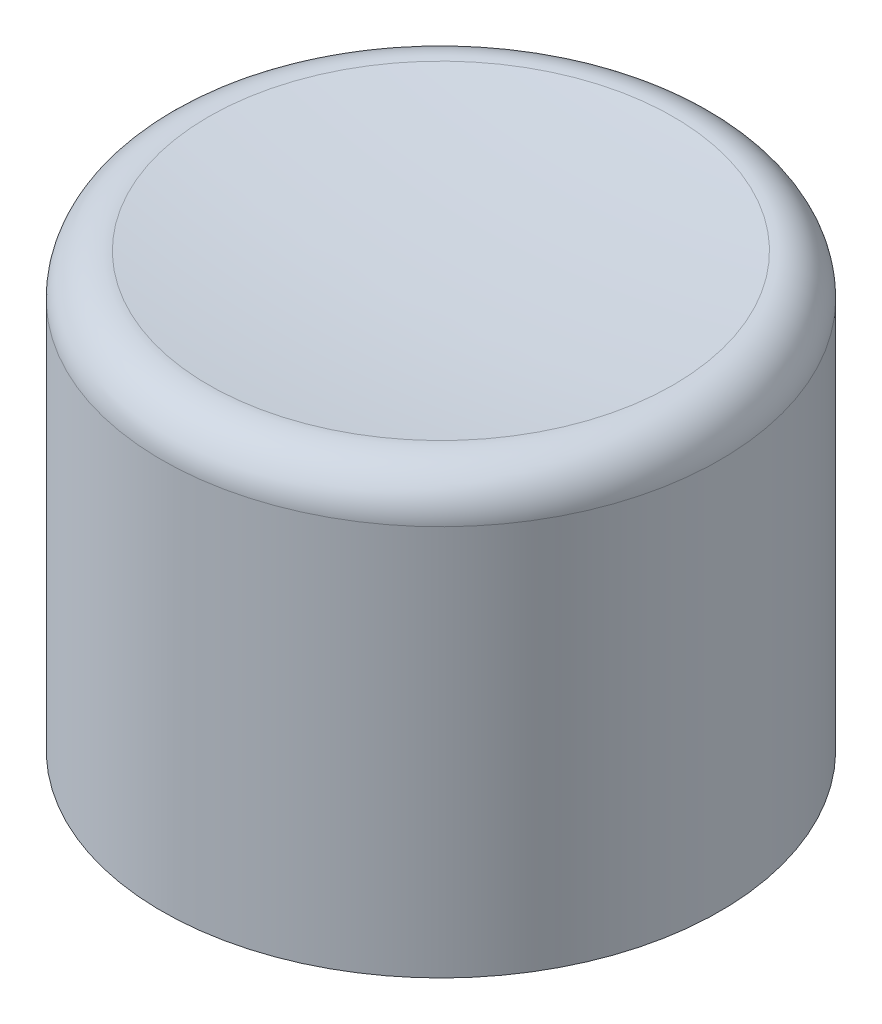
ISO-10303-21;
HEADER;
FILE_DESCRIPTION(('STEP AP214'),'2;1');
FILE_NAME('part.step','',(''),(''),'','','');
FILE_SCHEMA(('AUTOMOTIVE_DESIGN { 1 0 10303 214 1 1 1 1 }'));
ENDSEC;
DATA;
#1=APPLICATION_CONTEXT('core data for automotive mechanical design processes');
#2=APPLICATION_PROTOCOL_DEFINITION('international standard','automotive_design',2000,#1);
#3=PRODUCT_CONTEXT('',#1,'mechanical');
#4=PRODUCT('Part','Part','',(#3));
#5=PRODUCT_RELATED_PRODUCT_CATEGORY('part','',(#4));
#6=PRODUCT_DEFINITION_FORMATION('','',#4);
#7=PRODUCT_DEFINITION_CONTEXT('part definition',#1,'design');
#8=PRODUCT_DEFINITION('design','',#6,#7);
#9=PRODUCT_DEFINITION_SHAPE('','',#8);
#10=(LENGTH_UNIT() NAMED_UNIT(*) SI_UNIT(.MILLI.,.METRE.));
#11=(NAMED_UNIT(*) PLANE_ANGLE_UNIT() SI_UNIT($,.RADIAN.));
#12=(NAMED_UNIT(*) SI_UNIT($,.STERADIAN.) SOLID_ANGLE_UNIT());
#13=UNCERTAINTY_MEASURE_WITH_UNIT(LENGTH_MEASURE(1.E-05),#10,'distance_accuracy_value','');
#14=(GEOMETRIC_REPRESENTATION_CONTEXT(3) GLOBAL_UNCERTAINTY_ASSIGNED_CONTEXT((#13)) GLOBAL_UNIT_ASSIGNED_CONTEXT((#10,
#11,#12)) REPRESENTATION_CONTEXT('',''));
#15=CARTESIAN_POINT('',(0.,0.,0.));
#16=DIRECTION('',(0.,0.,1.));
#17=DIRECTION('',(1.,0.,0.));
#18=AXIS2_PLACEMENT_3D('',#15,#16,#17);
#19=CARTESIAN_POINT('',(-1.9304,0.,0.));
#20=DIRECTION('',(0.,-1.,0.));
#21=DIRECTION('',(1.,0.,0.));
#22=AXIS2_PLACEMENT_3D('',#19,#20,#21);
#23=PLANE('',#22);
#24=CARTESIAN_POINT('',(0.,0.,0.));
#25=DIRECTION('',(0.,1.,0.));
#26=DIRECTION('',(-1.,0.,0.));
#27=AXIS2_PLACEMENT_3D('',#24,#25,#26);
#28=CIRCLE('',#27,1.5494);
#29=CARTESIAN_POINT('',(-1.5494,0.,0.));
#30=VERTEX_POINT('',#29);
#31=EDGE_CURVE('E10',#30,#30,#28,.T.);
#32=ORIENTED_EDGE('',*,*,#31,.T.);
#33=EDGE_LOOP('',(#32));
#34=FACE_BOUND('',#33,.T.);
#35=CARTESIAN_POINT('',(0.,0.,0.));
#36=DIRECTION('',(0.,1.,0.));
#37=DIRECTION('',(-1.,0.,0.));
#38=AXIS2_PLACEMENT_3D('',#35,#36,#37);
#39=CIRCLE('',#38,1.9304);
#40=CARTESIAN_POINT('',(-1.9304,0.,0.));
#41=VERTEX_POINT('',#40);
#42=EDGE_CURVE('E61',#41,#41,#39,.T.);
#43=ORIENTED_EDGE('',*,*,#42,.F.);
#44=EDGE_LOOP('',(#43));
#45=FACE_BOUND('',#44,.T.);
#46=ADVANCED_FACE('F30',(#34,#45),#23,.T.);
#47=CARTESIAN_POINT('',(0.,0.,0.));
#48=DIRECTION('',(0.,1.,0.));
#49=DIRECTION('',(-1.,0.,0.));
#50=AXIS2_PLACEMENT_3D('',#47,#48,#49);
#51=CYLINDRICAL_SURFACE('',#50,1.5494);
#52=CARTESIAN_POINT('',(0.,3.048,0.));
#53=DIRECTION('',(0.,1.,0.));
#54=DIRECTION('',(-1.,0.,0.));
#55=AXIS2_PLACEMENT_3D('',#52,#53,#54);
#56=CIRCLE('',#55,1.5494);
#57=CARTESIAN_POINT('',(-1.5494,3.048,0.));
#58=VERTEX_POINT('',#57);
#59=EDGE_CURVE('E36',#58,#58,#56,.T.);
#60=ORIENTED_EDGE('',*,*,#59,.T.);
#61=EDGE_LOOP('',(#60));
#62=FACE_BOUND('',#61,.T.);
#63=ORIENTED_EDGE('',*,*,#31,.F.);
#64=EDGE_LOOP('',(#63));
#65=FACE_BOUND('',#64,.T.);
#66=ADVANCED_FACE('F69',(#62,#65),#51,.F.);
#67=CARTESIAN_POINT('',(-1.5494,3.048,0.));
#68=DIRECTION('',(0.,-1.,0.));
#69=DIRECTION('',(1.,0.,0.));
#70=AXIS2_PLACEMENT_3D('',#67,#68,#69);
#71=PLANE('',#70);
#72=ORIENTED_EDGE('',*,*,#59,.F.);
#73=EDGE_LOOP('',(#72));
#74=FACE_BOUND('',#73,.T.);
#75=ADVANCED_FACE('F73',(#74),#71,.T.);
#76=CARTESIAN_POINT('',(0.,21.844,0.));
#77=DIRECTION('',(0.,1.,0.));
#78=DIRECTION('',(-1.,0.,0.));
#79=AXIS2_PLACEMENT_3D('',#76,#77,#78);
#80=SPHERICAL_SURFACE('',#79,18.034);
#81=CARTESIAN_POINT('',(0.,3.9343724137931,0.));
#82=DIRECTION('',(0.,1.,0.));
#83=DIRECTION('',(-1.,0.,0.));
#84=AXIS2_PLACEMENT_3D('',#81,#82,#83);
#85=CIRCLE('',#84,2.11433103448277);
#86=CARTESIAN_POINT('',(-2.11433103448277,3.9343724137931,0.));
#87=VERTEX_POINT('',#86);
#88=EDGE_CURVE('E40',#87,#87,#85,.T.);
#89=ORIENTED_EDGE('',*,*,#88,.T.);
#90=EDGE_LOOP('',(#89));
#91=FACE_BOUND('',#90,.T.);
#92=ADVANCED_FACE('F77',(#91),#80,.F.);
#93=CARTESIAN_POINT('',(0.,3.556,0.));
#94=DIRECTION('',(0.,1.,0.));
#95=DIRECTION('',(-1.,0.,0.));
#96=AXIS2_PLACEMENT_3D('',#93,#94,#95);
#97=TOROIDAL_SURFACE('',#96,2.159,0.380999999999999);
#98=CARTESIAN_POINT('',(0.,3.556,0.));
#99=DIRECTION('',(0.,1.,0.));
#100=DIRECTION('',(-1.,0.,0.));
#101=AXIS2_PLACEMENT_3D('',#98,#99,#100);
#102=CIRCLE('',#101,2.54);
#103=CARTESIAN_POINT('',(-2.54,3.556,0.));
#104=VERTEX_POINT('',#103);
#105=EDGE_CURVE('E44',#104,#104,#102,.T.);
#106=ORIENTED_EDGE('',*,*,#105,.T.);
#107=EDGE_LOOP('',(#106));
#108=FACE_BOUND('',#107,.T.);
#109=ORIENTED_EDGE('',*,*,#88,.F.);
#110=EDGE_LOOP('',(#109));
#111=FACE_BOUND('',#110,.T.);
#112=ADVANCED_FACE('F84',(#108,#111),#97,.T.);
#113=CARTESIAN_POINT('',(0.,0.,0.));
#114=DIRECTION('',(0.,1.,0.));
#115=DIRECTION('',(-1.,0.,0.));
#116=AXIS2_PLACEMENT_3D('',#113,#114,#115);
#117=CYLINDRICAL_SURFACE('',#116,2.54);
#118=CARTESIAN_POINT('',(0.,0.,0.));
#119=DIRECTION('',(0.,1.,0.));
#120=DIRECTION('',(-1.,0.,0.));
#121=AXIS2_PLACEMENT_3D('',#118,#119,#120);
#122=CIRCLE('',#121,2.54);
#123=CARTESIAN_POINT('',(-2.54,0.,0.));
#124=VERTEX_POINT('',#123);
#125=EDGE_CURVE('E49',#124,#124,#122,.T.);
#126=ORIENTED_EDGE('',*,*,#125,.T.);
#127=EDGE_LOOP('',(#126));
#128=FACE_BOUND('',#127,.T.);
#129=ORIENTED_EDGE('',*,*,#105,.F.);
#130=EDGE_LOOP('',(#129));
#131=FACE_BOUND('',#130,.T.);
#132=ADVANCED_FACE('F88',(#128,#131),#117,.T.);
#133=CARTESIAN_POINT('',(-2.54,0.,0.));
#134=DIRECTION('',(0.,-1.,0.));
#135=DIRECTION('',(1.,0.,0.));
#136=AXIS2_PLACEMENT_3D('',#133,#134,#135);
#137=PLANE('',#136);
#138=CARTESIAN_POINT('',(0.,0.,0.));
#139=DIRECTION('',(0.,1.,0.));
#140=DIRECTION('',(-1.,0.,0.));
#141=AXIS2_PLACEMENT_3D('',#138,#139,#140);
#142=CIRCLE('',#141,2.159);
#143=CARTESIAN_POINT('',(-2.159,0.,0.));
#144=VERTEX_POINT('',#143);
#145=EDGE_CURVE('E52',#144,#144,#142,.T.);
#146=ORIENTED_EDGE('',*,*,#145,.T.);
#147=EDGE_LOOP('',(#146));
#148=FACE_BOUND('',#147,.T.);
#149=ORIENTED_EDGE('',*,*,#125,.F.);
#150=EDGE_LOOP('',(#149));
#151=FACE_BOUND('',#150,.T.);
#152=ADVANCED_FACE('F92',(#148,#151),#137,.T.);
#153=CARTESIAN_POINT('',(0.,0.,0.));
#154=DIRECTION('',(0.,1.,0.));
#155=DIRECTION('',(-1.,0.,0.));
#156=AXIS2_PLACEMENT_3D('',#153,#154,#155);
#157=CYLINDRICAL_SURFACE('',#156,2.159);
#158=CARTESIAN_POINT('',(0.,3.048,0.));
#159=DIRECTION('',(0.,1.,0.));
#160=DIRECTION('',(-1.,0.,0.));
#161=AXIS2_PLACEMENT_3D('',#158,#159,#160);
#162=CIRCLE('',#161,2.159);
#163=CARTESIAN_POINT('',(-2.159,3.048,0.));
#164=VERTEX_POINT('',#163);
#165=EDGE_CURVE('E55',#164,#164,#162,.T.);
#166=ORIENTED_EDGE('',*,*,#165,.T.);
#167=EDGE_LOOP('',(#166));
#168=FACE_BOUND('',#167,.T.);
#169=ORIENTED_EDGE('',*,*,#145,.F.);
#170=EDGE_LOOP('',(#169));
#171=FACE_BOUND('',#170,.T.);
#172=ADVANCED_FACE('F96',(#168,#171),#157,.F.);
#173=CARTESIAN_POINT('',(-2.159,3.048,0.));
#174=DIRECTION('',(0.,-1.,0.));
#175=DIRECTION('',(1.,0.,0.));
#176=AXIS2_PLACEMENT_3D('',#173,#174,#175);
#177=PLANE('',#176);
#178=CARTESIAN_POINT('',(0.,3.048,0.));
#179=DIRECTION('',(0.,1.,0.));
#180=DIRECTION('',(-1.,0.,0.));
#181=AXIS2_PLACEMENT_3D('',#178,#179,#180);
#182=CIRCLE('',#181,1.9304);
#183=CARTESIAN_POINT('',(-1.9304,3.048,0.));
#184=VERTEX_POINT('',#183);
#185=EDGE_CURVE('E58',#184,#184,#182,.T.);
#186=ORIENTED_EDGE('',*,*,#185,.T.);
#187=EDGE_LOOP('',(#186));
#188=FACE_BOUND('',#187,.T.);
#189=ORIENTED_EDGE('',*,*,#165,.F.);
#190=EDGE_LOOP('',(#189));
#191=FACE_BOUND('',#190,.T.);
#192=ADVANCED_FACE('F100',(#188,#191),#177,.T.);
#193=CARTESIAN_POINT('',(0.,0.,0.));
#194=DIRECTION('',(0.,1.,0.));
#195=DIRECTION('',(-1.,0.,0.));
#196=AXIS2_PLACEMENT_3D('',#193,#194,#195);
#197=CYLINDRICAL_SURFACE('',#196,1.9304);
#198=ORIENTED_EDGE('',*,*,#42,.T.);
#199=EDGE_LOOP('',(#198));
#200=FACE_BOUND('',#199,.T.);
#201=ORIENTED_EDGE('',*,*,#185,.F.);
#202=EDGE_LOOP('',(#201));
#203=FACE_BOUND('',#202,.T.);
#204=ADVANCED_FACE('F65',(#200,#203),#197,.T.);
#205=CLOSED_SHELL('',(#46,#66,#75,#92,#112,#132,#152,#172,#192,#204));
#206=MANIFOLD_SOLID_BREP('B2',#205);
#207=ADVANCED_BREP_SHAPE_REPRESENTATION('',(#18,#206),#14);
#208=SHAPE_DEFINITION_REPRESENTATION(#9,#207);
ENDSEC;
END-ISO-10303-21;
